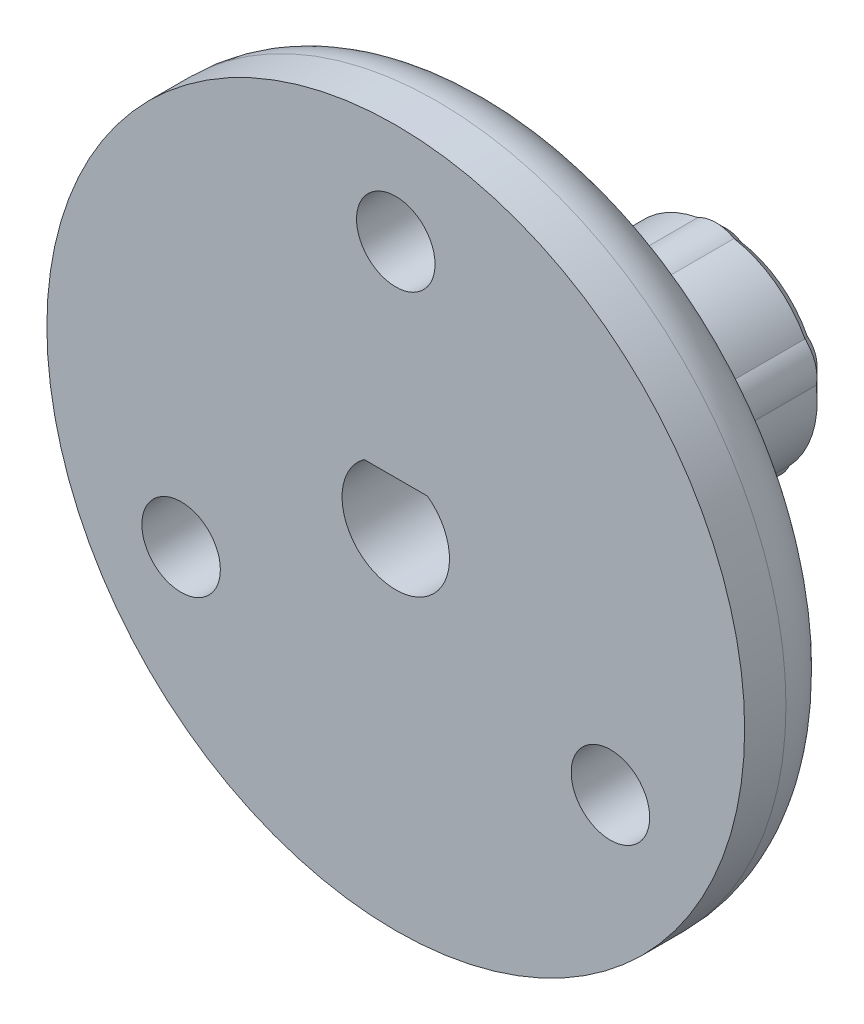
ISO-10303-21;
HEADER;
FILE_DESCRIPTION(('STEP AP214'),'2;1');
FILE_NAME('part.step','',(''),(''),'','','');
FILE_SCHEMA(('AUTOMOTIVE_DESIGN { 1 0 10303 214 1 1 1 1 }'));
ENDSEC;
DATA;
#1=APPLICATION_CONTEXT('core data for automotive mechanical design processes');
#2=APPLICATION_PROTOCOL_DEFINITION('international standard','automotive_design',2000,#1);
#3=PRODUCT_CONTEXT('',#1,'mechanical');
#4=PRODUCT('Part','Part','',(#3));
#5=PRODUCT_RELATED_PRODUCT_CATEGORY('part','',(#4));
#6=PRODUCT_DEFINITION_FORMATION('','',#4);
#7=PRODUCT_DEFINITION_CONTEXT('part definition',#1,'design');
#8=PRODUCT_DEFINITION('design','',#6,#7);
#9=PRODUCT_DEFINITION_SHAPE('','',#8);
#10=(LENGTH_UNIT() NAMED_UNIT(*) SI_UNIT(.MILLI.,.METRE.));
#11=(NAMED_UNIT(*) PLANE_ANGLE_UNIT() SI_UNIT($,.RADIAN.));
#12=(NAMED_UNIT(*) SI_UNIT($,.STERADIAN.) SOLID_ANGLE_UNIT());
#13=UNCERTAINTY_MEASURE_WITH_UNIT(LENGTH_MEASURE(1.E-05),#10,'distance_accuracy_value','');
#14=(GEOMETRIC_REPRESENTATION_CONTEXT(3) GLOBAL_UNCERTAINTY_ASSIGNED_CONTEXT((#13)) GLOBAL_UNIT_ASSIGNED_CONTEXT((#10,
#11,#12)) REPRESENTATION_CONTEXT('',''));
#15=CARTESIAN_POINT('',(0.,0.,0.));
#16=DIRECTION('',(0.,0.,1.));
#17=DIRECTION('',(1.,0.,0.));
#18=AXIS2_PLACEMENT_3D('',#15,#16,#17);
#19=CARTESIAN_POINT('',(0.,0.,16.));
#20=DIRECTION('',(0.,0.,-1.));
#21=DIRECTION('',(-1.,0.,0.));
#22=AXIS2_PLACEMENT_3D('',#19,#20,#21);
#23=CYLINDRICAL_SURFACE('',#22,4.9);
#24=DIRECTION('',(0.,0.,-1.));
#25=VECTOR('',#24,1.);
#26=CARTESIAN_POINT('',(-0.879711407089454,4.82038461538462,16.));
#27=LINE('',#26,#25);
#28=CARTESIAN_POINT('',(-0.879711407089453,4.82038461538462,8.));
#29=VERTEX_POINT('',#28);
#30=CARTESIAN_POINT('',(-0.879711407089454,4.82038461538462,0.499999999999987));
#31=VERTEX_POINT('',#30);
#32=EDGE_CURVE('E167',#29,#31,#27,.T.);
#33=ORIENTED_EDGE('',*,*,#32,.T.);
#34=CARTESIAN_POINT('',(0.,0.,0.499999999999987));
#35=DIRECTION('',(0.,0.,1.));
#36=DIRECTION('',(1.,0.,0.));
#37=AXIS2_PLACEMENT_3D('',#34,#35,#36);
#38=CIRCLE('',#37,4.9);
#39=CARTESIAN_POINT('',(-4.31261242457431,2.326236031749,0.499999999999987));
#40=VERTEX_POINT('',#39);
#41=EDGE_CURVE('E11',#31,#40,#38,.T.);
#42=ORIENTED_EDGE('',*,*,#41,.T.);
#43=DIRECTION('',(0.,0.,-1.));
#44=VECTOR('',#43,1.);
#45=CARTESIAN_POINT('',(-4.31261242457431,2.326236031749,16.));
#46=LINE('',#45,#44);
#47=CARTESIAN_POINT('',(-4.31261242457431,2.326236031749,8.));
#48=VERTEX_POINT('',#47);
#49=EDGE_CURVE('E181',#48,#40,#46,.T.);
#50=ORIENTED_EDGE('',*,*,#49,.F.);
#51=CARTESIAN_POINT('',(0.,0.,8.));
#52=DIRECTION('',(0.,0.,1.));
#53=DIRECTION('',(1.,0.,0.));
#54=AXIS2_PLACEMENT_3D('',#51,#52,#53);
#55=CIRCLE('',#54,4.9);
#56=EDGE_CURVE('E180',#29,#48,#55,.T.);
#57=ORIENTED_EDGE('',*,*,#56,.F.);
#58=EDGE_LOOP('',(#33,#42,#50,#57));
#59=FACE_BOUND('',#58,.T.);
#60=ADVANCED_FACE('F41',(#59),#23,.T.);
#61=CARTESIAN_POINT('',(-3.09093367795925,1.00430523171858,16.));
#62=DIRECTION('',(0.,0.,-1.));
#63=DIRECTION('',(-1.,0.,0.));
#64=AXIS2_PLACEMENT_3D('',#61,#62,#63);
#65=CYLINDRICAL_SURFACE('',#64,1.8);
#66=ORIENTED_EDGE('',*,*,#49,.T.);
#67=CARTESIAN_POINT('',(-3.09093367795925,1.00430523171858,0.499999999999987));
#68=DIRECTION('',(0.,0.,1.));
#69=DIRECTION('',(1.,0.,0.));
#70=AXIS2_PLACEMENT_3D('',#67,#68,#69);
#71=CIRCLE('',#70,1.8);
#72=CARTESIAN_POINT('',(-4.85630397444659,0.652925499405784,0.499999999999987));
#73=VERTEX_POINT('',#72);
#74=EDGE_CURVE('E56',#40,#73,#71,.T.);
#75=ORIENTED_EDGE('',*,*,#74,.T.);
#76=DIRECTION('',(0.,0.,-1.));
#77=VECTOR('',#76,1.);
#78=CARTESIAN_POINT('',(-4.85630397444659,0.652925499405784,16.));
#79=LINE('',#78,#77);
#80=CARTESIAN_POINT('',(-4.85630397444659,0.652925499405784,8.));
#81=VERTEX_POINT('',#80);
#82=EDGE_CURVE('E197',#81,#73,#79,.T.);
#83=ORIENTED_EDGE('',*,*,#82,.F.);
#84=CARTESIAN_POINT('',(-3.09093367795925,1.00430523171858,8.));
#85=DIRECTION('',(0.,0.,1.));
#86=DIRECTION('',(1.,0.,0.));
#87=AXIS2_PLACEMENT_3D('',#84,#85,#86);
#88=CIRCLE('',#87,1.8);
#89=EDGE_CURVE('E185',#48,#81,#88,.T.);
#90=ORIENTED_EDGE('',*,*,#89,.F.);
#91=EDGE_LOOP('',(#66,#75,#83,#90));
#92=FACE_BOUND('',#91,.T.);
#93=ADVANCED_FACE('F423',(#92),#65,.T.);
#94=ORIENTED_EDGE('',*,*,#82,.T.);
#95=CARTESIAN_POINT('',(0.,0.,0.499999999999987));
#96=DIRECTION('',(0.,0.,1.));
#97=DIRECTION('',(1.,0.,0.));
#98=AXIS2_PLACEMENT_3D('',#95,#96,#97);
#99=CIRCLE('',#98,4.9);
#100=CARTESIAN_POINT('',(-3.54505246578147,-3.38269168190906,0.499999999999987));
#101=VERTEX_POINT('',#100);
#102=EDGE_CURVE('E237',#73,#101,#99,.T.);
#103=ORIENTED_EDGE('',*,*,#102,.T.);
#104=DIRECTION('',(0.,0.,-1.));
#105=VECTOR('',#104,1.);
#106=CARTESIAN_POINT('',(-3.54505246578147,-3.38269168190906,16.));
#107=LINE('',#106,#105);
#108=CARTESIAN_POINT('',(-3.54505246578147,-3.38269168190906,8.));
#109=VERTEX_POINT('',#108);
#110=EDGE_CURVE('E416',#109,#101,#107,.T.);
#111=ORIENTED_EDGE('',*,*,#110,.F.);
#112=CARTESIAN_POINT('',(0.,0.,8.));
#113=DIRECTION('',(0.,0.,1.));
#114=DIRECTION('',(1.,0.,0.));
#115=AXIS2_PLACEMENT_3D('',#112,#113,#114);
#116=CIRCLE('',#115,4.9);
#117=EDGE_CURVE('E422',#81,#109,#116,.T.);
#118=ORIENTED_EDGE('',*,*,#117,.F.);
#119=EDGE_LOOP('',(#94,#103,#111,#118));
#120=FACE_BOUND('',#119,.T.);
#121=ADVANCED_FACE('F419',(#120),#23,.T.);
#122=CARTESIAN_POINT('',(-1.91030206995054,-2.62930523171858,16.));
#123=DIRECTION('',(0.,0.,-1.));
#124=DIRECTION('',(-1.,0.,0.));
#125=AXIS2_PLACEMENT_3D('',#122,#123,#124);
#126=CYLINDRICAL_SURFACE('',#125,1.8);
#127=ORIENTED_EDGE('',*,*,#110,.T.);
#128=CARTESIAN_POINT('',(-1.91030206995054,-2.62930523171858,0.499999999999987));
#129=DIRECTION('',(0.,0.,1.));
#130=DIRECTION('',(1.,0.,0.));
#131=AXIS2_PLACEMENT_3D('',#128,#129,#130);
#132=CIRCLE('',#131,1.8);
#133=CARTESIAN_POINT('',(-2.12164950881973,-4.41685446463034,0.499999999999987));
#134=VERTEX_POINT('',#133);
#135=EDGE_CURVE('E235',#101,#134,#132,.T.);
#136=ORIENTED_EDGE('',*,*,#135,.T.);
#137=DIRECTION('',(0.,0.,-1.));
#138=VECTOR('',#137,1.);
#139=CARTESIAN_POINT('',(-2.12164950881973,-4.41685446463034,16.));
#140=LINE('',#139,#138);
#141=CARTESIAN_POINT('',(-2.12164950881973,-4.41685446463034,8.));
#142=VERTEX_POINT('',#141);
#143=EDGE_CURVE('E413',#142,#134,#140,.T.);
#144=ORIENTED_EDGE('',*,*,#143,.F.);
#145=CARTESIAN_POINT('',(-1.91030206995054,-2.62930523171858,8.));
#146=DIRECTION('',(0.,0.,1.));
#147=DIRECTION('',(1.,0.,0.));
#148=AXIS2_PLACEMENT_3D('',#145,#146,#147);
#149=CIRCLE('',#148,1.8);
#150=EDGE_CURVE('E426',#109,#142,#149,.T.);
#151=ORIENTED_EDGE('',*,*,#150,.F.);
#152=EDGE_LOOP('',(#127,#136,#144,#151));
#153=FACE_BOUND('',#152,.T.);
#154=ADVANCED_FACE('F473',(#153),#126,.T.);
#155=ORIENTED_EDGE('',*,*,#143,.T.);
#156=CARTESIAN_POINT('',(0.,0.,0.499999999999987));
#157=DIRECTION('',(0.,0.,1.));
#158=DIRECTION('',(1.,0.,0.));
#159=AXIS2_PLACEMENT_3D('',#156,#157,#158);
#160=CIRCLE('',#159,4.9);
#161=CARTESIAN_POINT('',(2.12164950881973,-4.41685446463034,0.499999999999987));
#162=VERTEX_POINT('',#161);
#163=EDGE_CURVE('E233',#134,#162,#160,.T.);
#164=ORIENTED_EDGE('',*,*,#163,.T.);
#165=DIRECTION('',(0.,0.,-1.));
#166=VECTOR('',#165,1.);
#167=CARTESIAN_POINT('',(2.12164950881973,-4.41685446463034,16.));
#168=LINE('',#167,#166);
#169=CARTESIAN_POINT('',(2.12164950881973,-4.41685446463034,8.));
#170=VERTEX_POINT('',#169);
#171=EDGE_CURVE('E410',#170,#162,#168,.T.);
#172=ORIENTED_EDGE('',*,*,#171,.F.);
#173=CARTESIAN_POINT('',(0.,0.,8.));
#174=DIRECTION('',(0.,0.,1.));
#175=DIRECTION('',(1.,0.,0.));
#176=AXIS2_PLACEMENT_3D('',#173,#174,#175);
#177=CIRCLE('',#176,4.9);
#178=EDGE_CURVE('E498',#142,#170,#177,.T.);
#179=ORIENTED_EDGE('',*,*,#178,.F.);
#180=EDGE_LOOP('',(#155,#164,#172,#179));
#181=FACE_BOUND('',#180,.T.);
#182=ADVANCED_FACE('F474',(#181),#23,.T.);
#183=CARTESIAN_POINT('',(1.91030206995054,-2.62930523171858,16.));
#184=DIRECTION('',(0.,0.,-1.));
#185=DIRECTION('',(-1.,0.,0.));
#186=AXIS2_PLACEMENT_3D('',#183,#184,#185);
#187=CYLINDRICAL_SURFACE('',#186,1.8);
#188=ORIENTED_EDGE('',*,*,#171,.T.);
#189=CARTESIAN_POINT('',(1.91030206995054,-2.62930523171858,0.499999999999987));
#190=DIRECTION('',(0.,0.,1.));
#191=DIRECTION('',(1.,0.,0.));
#192=AXIS2_PLACEMENT_3D('',#189,#190,#191);
#193=CIRCLE('',#192,1.8);
#194=CARTESIAN_POINT('',(3.54505246578147,-3.38269168190906,0.499999999999987));
#195=VERTEX_POINT('',#194);
#196=EDGE_CURVE('E231',#162,#195,#193,.T.);
#197=ORIENTED_EDGE('',*,*,#196,.T.);
#198=DIRECTION('',(0.,0.,-1.));
#199=VECTOR('',#198,1.);
#200=CARTESIAN_POINT('',(3.54505246578147,-3.38269168190906,16.));
#201=LINE('',#200,#199);
#202=CARTESIAN_POINT('',(3.54505246578147,-3.38269168190906,8.));
#203=VERTEX_POINT('',#202);
#204=EDGE_CURVE('E404',#203,#195,#201,.T.);
#205=ORIENTED_EDGE('',*,*,#204,.F.);
#206=CARTESIAN_POINT('',(1.91030206995054,-2.62930523171858,8.));
#207=DIRECTION('',(0.,0.,1.));
#208=DIRECTION('',(1.,0.,0.));
#209=AXIS2_PLACEMENT_3D('',#206,#207,#208);
#210=CIRCLE('',#209,1.8);
#211=EDGE_CURVE('E500',#170,#203,#210,.T.);
#212=ORIENTED_EDGE('',*,*,#211,.F.);
#213=EDGE_LOOP('',(#188,#197,#205,#212));
#214=FACE_BOUND('',#213,.T.);
#215=ADVANCED_FACE('F481',(#214),#187,.T.);
#216=ORIENTED_EDGE('',*,*,#204,.T.);
#217=CARTESIAN_POINT('',(0.,0.,0.499999999999987));
#218=DIRECTION('',(0.,0.,1.));
#219=DIRECTION('',(1.,0.,0.));
#220=AXIS2_PLACEMENT_3D('',#217,#218,#219);
#221=CIRCLE('',#220,4.9);
#222=CARTESIAN_POINT('',(4.85630397444659,0.652925499405784,0.499999999999987));
#223=VERTEX_POINT('',#222);
#224=EDGE_CURVE('E229',#195,#223,#221,.T.);
#225=ORIENTED_EDGE('',*,*,#224,.T.);
#226=DIRECTION('',(0.,0.,-1.));
#227=VECTOR('',#226,1.);
#228=CARTESIAN_POINT('',(4.85630397444659,0.652925499405784,16.));
#229=LINE('',#228,#227);
#230=CARTESIAN_POINT('',(4.85630397444659,0.652925499405784,8.));
#231=VERTEX_POINT('',#230);
#232=EDGE_CURVE('E400',#231,#223,#229,.T.);
#233=ORIENTED_EDGE('',*,*,#232,.F.);
#234=CARTESIAN_POINT('',(0.,0.,8.));
#235=DIRECTION('',(0.,0.,1.));
#236=DIRECTION('',(1.,0.,0.));
#237=AXIS2_PLACEMENT_3D('',#234,#235,#236);
#238=CIRCLE('',#237,4.9);
#239=EDGE_CURVE('E504',#203,#231,#238,.T.);
#240=ORIENTED_EDGE('',*,*,#239,.F.);
#241=EDGE_LOOP('',(#216,#225,#233,#240));
#242=FACE_BOUND('',#241,.T.);
#243=ADVANCED_FACE('F476',(#242),#23,.T.);
#244=CARTESIAN_POINT('',(3.09093367795925,1.00430523171858,16.));
#245=DIRECTION('',(0.,0.,-1.));
#246=DIRECTION('',(-1.,0.,0.));
#247=AXIS2_PLACEMENT_3D('',#244,#245,#246);
#248=CYLINDRICAL_SURFACE('',#247,1.8);
#249=ORIENTED_EDGE('',*,*,#232,.T.);
#250=CARTESIAN_POINT('',(3.09093367795925,1.00430523171858,0.499999999999987));
#251=DIRECTION('',(0.,0.,1.));
#252=DIRECTION('',(1.,0.,0.));
#253=AXIS2_PLACEMENT_3D('',#250,#251,#252);
#254=CIRCLE('',#253,1.8);
#255=CARTESIAN_POINT('',(4.31261242457431,2.326236031749,0.499999999999987));
#256=VERTEX_POINT('',#255);
#257=EDGE_CURVE('E227',#223,#256,#254,.T.);
#258=ORIENTED_EDGE('',*,*,#257,.T.);
#259=DIRECTION('',(0.,0.,-1.));
#260=VECTOR('',#259,1.);
#261=CARTESIAN_POINT('',(4.31261242457431,2.326236031749,16.));
#262=LINE('',#261,#260);
#263=CARTESIAN_POINT('',(4.31261242457431,2.326236031749,8.));
#264=VERTEX_POINT('',#263);
#265=EDGE_CURVE('E398',#264,#256,#262,.T.);
#266=ORIENTED_EDGE('',*,*,#265,.F.);
#267=CARTESIAN_POINT('',(3.09093367795925,1.00430523171858,8.));
#268=DIRECTION('',(0.,0.,1.));
#269=DIRECTION('',(1.,0.,0.));
#270=AXIS2_PLACEMENT_3D('',#267,#268,#269);
#271=CIRCLE('',#270,1.8);
#272=EDGE_CURVE('E507',#231,#264,#271,.T.);
#273=ORIENTED_EDGE('',*,*,#272,.F.);
#274=EDGE_LOOP('',(#249,#258,#266,#273));
#275=FACE_BOUND('',#274,.T.);
#276=ADVANCED_FACE('F397',(#275),#248,.T.);
#277=ORIENTED_EDGE('',*,*,#265,.T.);
#278=CARTESIAN_POINT('',(0.,0.,0.499999999999987));
#279=DIRECTION('',(0.,0.,1.));
#280=DIRECTION('',(1.,0.,0.));
#281=AXIS2_PLACEMENT_3D('',#278,#279,#280);
#282=CIRCLE('',#281,4.9);
#283=CARTESIAN_POINT('',(0.879711407089454,4.82038461538462,0.499999999999987));
#284=VERTEX_POINT('',#283);
#285=EDGE_CURVE('E225',#256,#284,#282,.T.);
#286=ORIENTED_EDGE('',*,*,#285,.T.);
#287=DIRECTION('',(0.,0.,-1.));
#288=VECTOR('',#287,1.);
#289=CARTESIAN_POINT('',(0.879711407089454,4.82038461538462,16.));
#290=LINE('',#289,#288);
#291=CARTESIAN_POINT('',(0.879711407089454,4.82038461538462,8.));
#292=VERTEX_POINT('',#291);
#293=EDGE_CURVE('E176',#292,#284,#290,.T.);
#294=ORIENTED_EDGE('',*,*,#293,.F.);
#295=CARTESIAN_POINT('',(0.,0.,8.));
#296=DIRECTION('',(0.,0.,1.));
#297=DIRECTION('',(1.,0.,0.));
#298=AXIS2_PLACEMENT_3D('',#295,#296,#297);
#299=CIRCLE('',#298,4.9);
#300=EDGE_CURVE('E191',#264,#292,#299,.T.);
#301=ORIENTED_EDGE('',*,*,#300,.F.);
#302=EDGE_LOOP('',(#277,#286,#294,#301));
#303=FACE_BOUND('',#302,.T.);
#304=ADVANCED_FACE('F402',(#303),#23,.T.);
#305=CARTESIAN_POINT('',(0.,3.25,16.));
#306=DIRECTION('',(0.,0.,-1.));
#307=DIRECTION('',(-1.,0.,0.));
#308=AXIS2_PLACEMENT_3D('',#305,#306,#307);
#309=CYLINDRICAL_SURFACE('',#308,1.8);
#310=ORIENTED_EDGE('',*,*,#293,.T.);
#311=CARTESIAN_POINT('',(0.,3.25,0.499999999999987));
#312=DIRECTION('',(0.,0.,1.));
#313=DIRECTION('',(1.,0.,0.));
#314=AXIS2_PLACEMENT_3D('',#311,#312,#313);
#315=CIRCLE('',#314,1.8);
#316=EDGE_CURVE('E175',#284,#31,#315,.T.);
#317=ORIENTED_EDGE('',*,*,#316,.T.);
#318=ORIENTED_EDGE('',*,*,#32,.F.);
#319=CARTESIAN_POINT('',(0.,3.25,8.));
#320=DIRECTION('',(0.,0.,1.));
#321=DIRECTION('',(1.,0.,0.));
#322=AXIS2_PLACEMENT_3D('',#319,#320,#321);
#323=CIRCLE('',#322,1.8);
#324=EDGE_CURVE('E172',#292,#29,#323,.T.);
#325=ORIENTED_EDGE('',*,*,#324,.F.);
#326=EDGE_LOOP('',(#310,#317,#318,#325));
#327=FACE_BOUND('',#326,.T.);
#328=ADVANCED_FACE('F170',(#327),#309,.T.);
#329=CARTESIAN_POINT('',(0.,0.,16.));
#330=DIRECTION('',(0.,0.,1.));
#331=DIRECTION('',(1.,0.,0.));
#332=AXIS2_PLACEMENT_3D('',#329,#330,#331);
#333=PLANE('',#332);
#334=CARTESIAN_POINT('',(10.3923048454132,-6.00000000000005,16.));
#335=DIRECTION('',(0.,0.,1.));
#336=DIRECTION('',(-0.500000000000004,-0.866025403784436,0.));
#337=AXIS2_PLACEMENT_3D('',#334,#335,#336);
#338=CIRCLE('',#337,1.9);
#339=CARTESIAN_POINT('',(9.44230484541323,-7.64544826719048,16.));
#340=VERTEX_POINT('',#339);
#341=EDGE_CURVE('E531',#340,#340,#338,.T.);
#342=ORIENTED_EDGE('',*,*,#341,.F.);
#343=EDGE_LOOP('',(#342));
#344=FACE_BOUND('',#343,.T.);
#345=CARTESIAN_POINT('',(-10.3923048454133,-5.9999999999999,16.));
#346=DIRECTION('',(0.,0.,1.));
#347=DIRECTION('',(-0.499999999999992,0.866025403784443,0.));
#348=AXIS2_PLACEMENT_3D('',#345,#346,#347);
#349=CIRCLE('',#348,1.9);
#350=CARTESIAN_POINT('',(-11.3423048454133,-4.35455173280946,16.));
#351=VERTEX_POINT('',#350);
#352=EDGE_CURVE('E356',#351,#351,#349,.T.);
#353=ORIENTED_EDGE('',*,*,#352,.F.);
#354=EDGE_LOOP('',(#353));
#355=FACE_BOUND('',#354,.T.);
#356=CARTESIAN_POINT('',(0.,12.,16.));
#357=DIRECTION('',(0.,0.,1.));
#358=DIRECTION('',(1.,0.,0.));
#359=AXIS2_PLACEMENT_3D('',#356,#357,#358);
#360=CIRCLE('',#359,1.9);
#361=CARTESIAN_POINT('',(1.9,12.,16.));
#362=VERTEX_POINT('',#361);
#363=EDGE_CURVE('E520',#362,#362,#360,.T.);
#364=ORIENTED_EDGE('',*,*,#363,.F.);
#365=EDGE_LOOP('',(#364));
#366=FACE_BOUND('',#365,.T.);
#367=DIRECTION('',(1.,0.,0.));
#368=VECTOR('',#367,1.);
#369=CARTESIAN_POINT('',(1.53297097167559,2.1,16.));
#370=LINE('',#369,#368);
#371=CARTESIAN_POINT('',(-1.53297097167559,2.1,16.));
#372=VERTEX_POINT('',#371);
#373=CARTESIAN_POINT('',(1.53297097167559,2.1,16.));
#374=VERTEX_POINT('',#373);
#375=EDGE_CURVE('E432',#372,#374,#370,.T.);
#376=ORIENTED_EDGE('',*,*,#375,.T.);
#377=CARTESIAN_POINT('',(0.,0.,16.));
#378=DIRECTION('',(0.,0.,1.));
#379=DIRECTION('',(1.,0.,0.));
#380=AXIS2_PLACEMENT_3D('',#377,#378,#379);
#381=CIRCLE('',#380,2.6);
#382=EDGE_CURVE('E438',#374,#372,#381,.F.);
#383=ORIENTED_EDGE('',*,*,#382,.T.);
#384=EDGE_LOOP('',(#376,#383));
#385=FACE_BOUND('',#384,.T.);
#386=CARTESIAN_POINT('',(0.,0.,16.));
#387=DIRECTION('',(0.,0.,1.));
#388=DIRECTION('',(1.,0.,0.));
#389=AXIS2_PLACEMENT_3D('',#386,#387,#388);
#390=CIRCLE('',#389,16.8909336779592);
#391=CARTESIAN_POINT('',(16.8909336779592,0.,16.));
#392=VERTEX_POINT('',#391);
#393=EDGE_CURVE('E513',#392,#392,#390,.T.);
#394=ORIENTED_EDGE('',*,*,#393,.T.);
#395=EDGE_LOOP('',(#394));
#396=FACE_BOUND('',#395,.T.);
#397=ADVANCED_FACE('F452',(#344,#355,#366,#385,#396),#333,.T.);
#398=CARTESIAN_POINT('',(0.,0.,0.));
#399=DIRECTION('',(0.,0.,1.));
#400=DIRECTION('',(1.,0.,0.));
#401=AXIS2_PLACEMENT_3D('',#398,#399,#400);
#402=PLANE('',#401);
#403=CARTESIAN_POINT('',(0.,0.,0.));
#404=DIRECTION('',(0.,0.,1.));
#405=DIRECTION('',(1.,0.,0.));
#406=AXIS2_PLACEMENT_3D('',#403,#404,#405);
#407=CIRCLE('',#406,4.40000000000001);
#408=CARTESIAN_POINT('',(-3.91360925292221,2.01088602746196,0.));
#409=VERTEX_POINT('',#408);
#410=CARTESIAN_POINT('',(-0.703094491448568,4.34346153846155,0.));
#411=VERTEX_POINT('',#410);
#412=EDGE_CURVE('E204',#409,#411,#407,.F.);
#413=ORIENTED_EDGE('',*,*,#412,.T.);
#414=CARTESIAN_POINT('',(0.,3.25,0.));
#415=DIRECTION('',(0.,0.,1.));
#416=DIRECTION('',(1.,0.,0.));
#417=AXIS2_PLACEMENT_3D('',#414,#415,#416);
#418=CIRCLE('',#417,1.30000000000001);
#419=CARTESIAN_POINT('',(0.703094491448568,4.34346153846155,0.));
#420=VERTEX_POINT('',#419);
#421=EDGE_CURVE('E222',#411,#420,#418,.F.);
#422=ORIENTED_EDGE('',*,*,#421,.T.);
#423=CARTESIAN_POINT('',(0.,0.,0.));
#424=DIRECTION('',(0.,0.,1.));
#425=DIRECTION('',(1.,0.,0.));
#426=AXIS2_PLACEMENT_3D('',#423,#424,#425);
#427=CIRCLE('',#426,4.40000000000001);
#428=CARTESIAN_POINT('',(3.91360925292221,2.01088602746196,0.));
#429=VERTEX_POINT('',#428);
#430=EDGE_CURVE('E220',#420,#429,#427,.F.);
#431=ORIENTED_EDGE('',*,*,#430,.T.);
#432=CARTESIAN_POINT('',(3.09093367795925,1.00430523171858,0.));
#433=DIRECTION('',(0.,0.,1.));
#434=DIRECTION('',(1.,0.,0.));
#435=AXIS2_PLACEMENT_3D('',#432,#433,#434);
#436=CIRCLE('',#435,1.30000000000001);
#437=CARTESIAN_POINT('',(4.34814554594025,0.673520832135182,0.));
#438=VERTEX_POINT('',#437);
#439=EDGE_CURVE('E218',#429,#438,#436,.F.);
#440=ORIENTED_EDGE('',*,*,#439,.T.);
#441=CARTESIAN_POINT('',(0.,0.,0.));
#442=DIRECTION('',(0.,0.,1.));
#443=DIRECTION('',(1.,0.,0.));
#444=AXIS2_PLACEMENT_3D('',#441,#442,#443);
#445=CIRCLE('',#444,4.40000000000001);
#446=CARTESIAN_POINT('',(3.12183802844058,-3.1006656259878,0.));
#447=VERTEX_POINT('',#446);
#448=EDGE_CURVE('E216',#438,#447,#445,.F.);
#449=ORIENTED_EDGE('',*,*,#448,.T.);
#450=CARTESIAN_POINT('',(1.91030206995054,-2.62930523171858,0.));
#451=DIRECTION('',(0.,0.,1.));
#452=DIRECTION('',(1.,0.,0.));
#453=AXIS2_PLACEMENT_3D('',#450,#451,#452);
#454=CIRCLE('',#453,1.30000000000001);
#455=CARTESIAN_POINT('',(1.98420724397397,-3.92720277207089,0.));
#456=VERTEX_POINT('',#455);
#457=EDGE_CURVE('E214',#447,#456,#454,.F.);
#458=ORIENTED_EDGE('',*,*,#457,.T.);
#459=CARTESIAN_POINT('',(0.,0.,0.));
#460=DIRECTION('',(0.,0.,1.));
#461=DIRECTION('',(1.,0.,0.));
#462=AXIS2_PLACEMENT_3D('',#459,#460,#461);
#463=CIRCLE('',#462,4.40000000000001);
#464=CARTESIAN_POINT('',(-1.98420724397397,-3.92720277207089,0.));
#465=VERTEX_POINT('',#464);
#466=EDGE_CURVE('E212',#456,#465,#463,.F.);
#467=ORIENTED_EDGE('',*,*,#466,.T.);
#468=CARTESIAN_POINT('',(-1.91030206995054,-2.62930523171858,0.));
#469=DIRECTION('',(0.,0.,1.));
#470=DIRECTION('',(1.,0.,0.));
#471=AXIS2_PLACEMENT_3D('',#468,#469,#470);
#472=CIRCLE('',#471,1.30000000000001);
#473=CARTESIAN_POINT('',(-3.12183802844058,-3.1006656259878,0.));
#474=VERTEX_POINT('',#473);
#475=EDGE_CURVE('E210',#465,#474,#472,.F.);
#476=ORIENTED_EDGE('',*,*,#475,.T.);
#477=CARTESIAN_POINT('',(0.,0.,0.));
#478=DIRECTION('',(0.,0.,1.));
#479=DIRECTION('',(1.,0.,0.));
#480=AXIS2_PLACEMENT_3D('',#477,#478,#479);
#481=CIRCLE('',#480,4.40000000000001);
#482=CARTESIAN_POINT('',(-4.34814554594025,0.673520832135183,0.));
#483=VERTEX_POINT('',#482);
#484=EDGE_CURVE('E208',#474,#483,#481,.F.);
#485=ORIENTED_EDGE('',*,*,#484,.T.);
#486=CARTESIAN_POINT('',(-3.09093367795925,1.00430523171858,0.));
#487=DIRECTION('',(0.,0.,1.));
#488=DIRECTION('',(1.,0.,0.));
#489=AXIS2_PLACEMENT_3D('',#486,#487,#488);
#490=CIRCLE('',#489,1.30000000000001);
#491=EDGE_CURVE('E206',#483,#409,#490,.F.);
#492=ORIENTED_EDGE('',*,*,#491,.T.);
#493=EDGE_LOOP('',(#413,#422,#431,#440,#449,#458,#467,#476,#485,#492));
#494=FACE_BOUND('',#493,.T.);
#495=CARTESIAN_POINT('',(0.,0.,0.));
#496=DIRECTION('',(0.,0.,-1.));
#497=DIRECTION('',(-1.,0.,0.));
#498=AXIS2_PLACEMENT_3D('',#495,#496,#497);
#499=CIRCLE('',#498,2.6);
#500=CARTESIAN_POINT('',(1.53297097167559,2.1,0.));
#501=VERTEX_POINT('',#500);
#502=CARTESIAN_POINT('',(-1.53297097167559,2.1,0.));
#503=VERTEX_POINT('',#502);
#504=EDGE_CURVE('E184',#501,#503,#499,.T.);
#505=ORIENTED_EDGE('',*,*,#504,.F.);
#506=DIRECTION('',(1.,0.,0.));
#507=VECTOR('',#506,1.);
#508=CARTESIAN_POINT('',(1.53297097167559,2.1,0.));
#509=LINE('',#508,#507);
#510=EDGE_CURVE('E430',#503,#501,#509,.T.);
#511=ORIENTED_EDGE('',*,*,#510,.F.);
#512=EDGE_LOOP('',(#505,#511));
#513=FACE_BOUND('',#512,.T.);
#514=ADVANCED_FACE('F370',(#494,#513),#402,.F.);
#515=CARTESIAN_POINT('',(1.53297097167559,2.1,23.00927956355));
#516=DIRECTION('',(0.,1.,0.));
#517=DIRECTION('',(0.,0.,1.));
#518=AXIS2_PLACEMENT_3D('',#515,#516,#517);
#519=PLANE('',#518);
#520=DIRECTION('',(0.,0.,-1.));
#521=VECTOR('',#520,1.);
#522=CARTESIAN_POINT('',(-1.53297097167559,2.1,23.00927956355));
#523=LINE('',#522,#521);
#524=EDGE_CURVE('E177',#372,#503,#523,.T.);
#525=ORIENTED_EDGE('',*,*,#524,.T.);
#526=ORIENTED_EDGE('',*,*,#510,.T.);
#527=DIRECTION('',(0.,0.,-1.));
#528=VECTOR('',#527,1.);
#529=CARTESIAN_POINT('',(1.53297097167559,2.1,23.00927956355));
#530=LINE('',#529,#528);
#531=EDGE_CURVE('E437',#374,#501,#530,.T.);
#532=ORIENTED_EDGE('',*,*,#531,.F.);
#533=ORIENTED_EDGE('',*,*,#375,.F.);
#534=EDGE_LOOP('',(#525,#526,#532,#533));
#535=FACE_BOUND('',#534,.T.);
#536=ADVANCED_FACE('F445',(#535),#519,.F.);
#537=CARTESIAN_POINT('',(0.,0.,23.00927956355));
#538=DIRECTION('',(0.,0.,-1.));
#539=DIRECTION('',(-1.,0.,0.));
#540=AXIS2_PLACEMENT_3D('',#537,#538,#539);
#541=CYLINDRICAL_SURFACE('',#540,2.6);
#542=ORIENTED_EDGE('',*,*,#531,.T.);
#543=ORIENTED_EDGE('',*,*,#504,.T.);
#544=ORIENTED_EDGE('',*,*,#524,.F.);
#545=ORIENTED_EDGE('',*,*,#382,.F.);
#546=EDGE_LOOP('',(#542,#543,#544,#545));
#547=FACE_BOUND('',#546,.T.);
#548=ADVANCED_FACE('F450',(#547),#541,.F.);
#549=CARTESIAN_POINT('',(0.,0.,16.));
#550=DIRECTION('',(0.,0.,1.));
#551=DIRECTION('',(1.,0.,0.));
#552=AXIS2_PLACEMENT_3D('',#549,#550,#551);
#553=CYLINDRICAL_SURFACE('',#552,6.89093367795925);
#554=CARTESIAN_POINT('',(0.,0.,11.));
#555=DIRECTION('',(0.,0.,1.));
#556=DIRECTION('',(1.,0.,0.));
#557=AXIS2_PLACEMENT_3D('',#554,#555,#556);
#558=CIRCLE('',#557,6.89093367795925);
#559=CARTESIAN_POINT('',(6.89093367795925,0.,11.));
#560=VERTEX_POINT('',#559);
#561=EDGE_CURVE('E516',#560,#560,#558,.T.);
#562=ORIENTED_EDGE('',*,*,#561,.F.);
#563=EDGE_LOOP('',(#562));
#564=FACE_BOUND('',#563,.T.);
#565=CARTESIAN_POINT('',(0.,0.,8.));
#566=DIRECTION('',(0.,0.,1.));
#567=DIRECTION('',(1.,0.,0.));
#568=AXIS2_PLACEMENT_3D('',#565,#566,#567);
#569=CIRCLE('',#568,6.89093367795925);
#570=CARTESIAN_POINT('',(6.89093367795925,0.,8.));
#571=VERTEX_POINT('',#570);
#572=EDGE_CURVE('E510',#571,#571,#569,.T.);
#573=ORIENTED_EDGE('',*,*,#572,.T.);
#574=EDGE_LOOP('',(#573));
#575=FACE_BOUND('',#574,.T.);
#576=ADVANCED_FACE('F565',(#564,#575),#553,.T.);
#577=CARTESIAN_POINT('',(-6.89093367795925,0.,8.));
#578=DIRECTION('',(0.,0.,1.));
#579=DIRECTION('',(1.,0.,0.));
#580=AXIS2_PLACEMENT_3D('',#577,#578,#579);
#581=PLANE('',#580);
#582=ORIENTED_EDGE('',*,*,#324,.T.);
#583=ORIENTED_EDGE('',*,*,#56,.T.);
#584=ORIENTED_EDGE('',*,*,#89,.T.);
#585=ORIENTED_EDGE('',*,*,#117,.T.);
#586=ORIENTED_EDGE('',*,*,#150,.T.);
#587=ORIENTED_EDGE('',*,*,#178,.T.);
#588=ORIENTED_EDGE('',*,*,#211,.T.);
#589=ORIENTED_EDGE('',*,*,#239,.T.);
#590=ORIENTED_EDGE('',*,*,#272,.T.);
#591=ORIENTED_EDGE('',*,*,#300,.T.);
#592=EDGE_LOOP('',(#582,#583,#584,#585,#586,#587,#588,#589,#590,#591));
#593=FACE_BOUND('',#592,.T.);
#594=ORIENTED_EDGE('',*,*,#572,.F.);
#595=EDGE_LOOP('',(#594));
#596=FACE_BOUND('',#595,.T.);
#597=ADVANCED_FACE('F188',(#593,#596),#581,.F.);
#598=CARTESIAN_POINT('',(0.,0.,16.));
#599=DIRECTION('',(0.,0.,1.));
#600=DIRECTION('',(1.,0.,0.));
#601=AXIS2_PLACEMENT_3D('',#598,#599,#600);
#602=CYLINDRICAL_SURFACE('',#601,16.8909336779592);
#603=CARTESIAN_POINT('',(0.,0.,14.));
#604=DIRECTION('',(0.,0.,1.));
#605=DIRECTION('',(1.,0.,0.));
#606=AXIS2_PLACEMENT_3D('',#603,#604,#605);
#607=CIRCLE('',#606,16.8909336779592);
#608=CARTESIAN_POINT('',(16.8909336779592,0.,14.));
#609=VERTEX_POINT('',#608);
#610=EDGE_CURVE('E192',#609,#609,#607,.T.);
#611=ORIENTED_EDGE('',*,*,#610,.T.);
#612=EDGE_LOOP('',(#611));
#613=FACE_BOUND('',#612,.T.);
#614=ORIENTED_EDGE('',*,*,#393,.F.);
#615=EDGE_LOOP('',(#614));
#616=FACE_BOUND('',#615,.T.);
#617=ADVANCED_FACE('F553',(#613,#616),#602,.T.);
#618=CARTESIAN_POINT('',(-16.8909336779592,0.,11.));
#619=DIRECTION('',(0.,0.,1.));
#620=DIRECTION('',(1.,0.,0.));
#621=AXIS2_PLACEMENT_3D('',#618,#619,#620);
#622=PLANE('',#621);
#623=CARTESIAN_POINT('',(0.,0.,11.));
#624=DIRECTION('',(0.,0.,1.));
#625=DIRECTION('',(1.,0.,0.));
#626=AXIS2_PLACEMENT_3D('',#623,#624,#625);
#627=CIRCLE('',#626,13.8909336779592);
#628=CARTESIAN_POINT('',(13.8909336779592,0.,11.));
#629=VERTEX_POINT('',#628);
#630=EDGE_CURVE('E195',#629,#629,#627,.F.);
#631=ORIENTED_EDGE('',*,*,#630,.T.);
#632=EDGE_LOOP('',(#631));
#633=FACE_BOUND('',#632,.T.);
#634=ORIENTED_EDGE('',*,*,#561,.T.);
#635=EDGE_LOOP('',(#634));
#636=FACE_BOUND('',#635,.T.);
#637=ADVANCED_FACE('F555',(#633,#636),#622,.F.);
#638=CARTESIAN_POINT('',(0.,0.,14.));
#639=DIRECTION('',(0.,0.,1.));
#640=DIRECTION('',(1.,0.,0.));
#641=AXIS2_PLACEMENT_3D('',#638,#639,#640);
#642=TOROIDAL_SURFACE('',#641,13.8909336779592,3.);
#643=ORIENTED_EDGE('',*,*,#630,.F.);
#644=EDGE_LOOP('',(#643));
#645=FACE_BOUND('',#644,.T.);
#646=ORIENTED_EDGE('',*,*,#610,.F.);
#647=EDGE_LOOP('',(#646));
#648=FACE_BOUND('',#647,.T.);
#649=ADVANCED_FACE('F562',(#645,#648),#642,.T.);
#650=CARTESIAN_POINT('',(0.,12.,11.5));
#651=DIRECTION('',(0.,0.,1.));
#652=DIRECTION('',(1.,0.,0.));
#653=AXIS2_PLACEMENT_3D('',#650,#651,#652);
#654=CYLINDRICAL_SURFACE('',#653,1.9);
#655=CARTESIAN_POINT('',(0.,12.,11.5));
#656=DIRECTION('',(0.,0.,1.));
#657=DIRECTION('',(1.,0.,0.));
#658=AXIS2_PLACEMENT_3D('',#655,#656,#657);
#659=CIRCLE('',#658,1.9);
#660=CARTESIAN_POINT('',(1.9,12.,11.5));
#661=VERTEX_POINT('',#660);
#662=EDGE_CURVE('E519',#661,#661,#659,.T.);
#663=ORIENTED_EDGE('',*,*,#662,.F.);
#664=EDGE_LOOP('',(#663));
#665=FACE_BOUND('',#664,.T.);
#666=ORIENTED_EDGE('',*,*,#363,.T.);
#667=EDGE_LOOP('',(#666));
#668=FACE_BOUND('',#667,.T.);
#669=ADVANCED_FACE('F609',(#665,#668),#654,.F.);
#670=CARTESIAN_POINT('',(0.,12.,11.5));
#671=DIRECTION('',(0.,0.,1.));
#672=DIRECTION('',(1.,0.,0.));
#673=AXIS2_PLACEMENT_3D('',#670,#671,#672);
#674=PLANE('',#673);
#675=ORIENTED_EDGE('',*,*,#662,.T.);
#676=EDGE_LOOP('',(#675));
#677=FACE_BOUND('',#676,.T.);
#678=ADVANCED_FACE('F618',(#677),#674,.T.);
#679=CARTESIAN_POINT('',(-10.3923048454133,-5.9999999999999,11.5));
#680=DIRECTION('',(0.,0.,1.));
#681=DIRECTION('',(1.,0.,0.));
#682=AXIS2_PLACEMENT_3D('',#679,#680,#681);
#683=CYLINDRICAL_SURFACE('',#682,1.9);
#684=CARTESIAN_POINT('',(-10.3923048454133,-5.9999999999999,11.5));
#685=DIRECTION('',(0.,0.,1.));
#686=DIRECTION('',(-0.499999999999992,0.866025403784443,0.));
#687=AXIS2_PLACEMENT_3D('',#684,#685,#686);
#688=CIRCLE('',#687,1.9);
#689=CARTESIAN_POINT('',(-11.3423048454133,-4.35455173280946,11.5));
#690=VERTEX_POINT('',#689);
#691=EDGE_CURVE('E528',#690,#690,#688,.T.);
#692=ORIENTED_EDGE('',*,*,#691,.F.);
#693=EDGE_LOOP('',(#692));
#694=FACE_BOUND('',#693,.T.);
#695=ORIENTED_EDGE('',*,*,#352,.T.);
#696=EDGE_LOOP('',(#695));
#697=FACE_BOUND('',#696,.T.);
#698=ADVANCED_FACE('F627',(#694,#697),#683,.F.);
#699=CARTESIAN_POINT('',(-10.3923048454133,-5.9999999999999,11.5));
#700=DIRECTION('',(0.,0.,1.));
#701=DIRECTION('',(-0.499999999999992,0.866025403784443,0.));
#702=AXIS2_PLACEMENT_3D('',#699,#700,#701);
#703=PLANE('',#702);
#704=ORIENTED_EDGE('',*,*,#691,.T.);
#705=EDGE_LOOP('',(#704));
#706=FACE_BOUND('',#705,.T.);
#707=ADVANCED_FACE('F542',(#706),#703,.T.);
#708=CARTESIAN_POINT('',(10.3923048454132,-6.00000000000005,11.5));
#709=DIRECTION('',(0.,0.,1.));
#710=DIRECTION('',(1.,0.,0.));
#711=AXIS2_PLACEMENT_3D('',#708,#709,#710);
#712=CYLINDRICAL_SURFACE('',#711,1.9);
#713=CARTESIAN_POINT('',(10.3923048454132,-6.00000000000005,11.5));
#714=DIRECTION('',(0.,0.,1.));
#715=DIRECTION('',(-0.500000000000004,-0.866025403784436,0.));
#716=AXIS2_PLACEMENT_3D('',#713,#714,#715);
#717=CIRCLE('',#716,1.9);
#718=CARTESIAN_POINT('',(9.44230484541323,-7.64544826719048,11.5));
#719=VERTEX_POINT('',#718);
#720=EDGE_CURVE('E523',#719,#719,#717,.T.);
#721=ORIENTED_EDGE('',*,*,#720,.F.);
#722=EDGE_LOOP('',(#721));
#723=FACE_BOUND('',#722,.T.);
#724=ORIENTED_EDGE('',*,*,#341,.T.);
#725=EDGE_LOOP('',(#724));
#726=FACE_BOUND('',#725,.T.);
#727=ADVANCED_FACE('F539',(#723,#726),#712,.F.);
#728=CARTESIAN_POINT('',(10.3923048454132,-6.00000000000005,11.5));
#729=DIRECTION('',(0.,0.,1.));
#730=DIRECTION('',(-0.500000000000004,-0.866025403784436,0.));
#731=AXIS2_PLACEMENT_3D('',#728,#729,#730);
#732=PLANE('',#731);
#733=ORIENTED_EDGE('',*,*,#720,.T.);
#734=EDGE_LOOP('',(#733));
#735=FACE_BOUND('',#734,.T.);
#736=ADVANCED_FACE('F537',(#735),#732,.T.);
#737=CARTESIAN_POINT('',(0.,0.,0.499999999999987));
#738=DIRECTION('',(0.,0.,1.));
#739=DIRECTION('',(1.,0.,0.));
#740=AXIS2_PLACEMENT_3D('',#737,#738,#739);
#741=CONICAL_SURFACE('',#740,4.9,0.785398163397454);
#742=CARTESIAN_POINT('',(-1.98420724397397,-3.92720277207089,0.));
#743=CARTESIAN_POINT('',(-1.99522545414142,-3.96821882156102,0.0415780074214474));
#744=CARTESIAN_POINT('',(-2.00637530890947,-4.00917140027715,0.0831833042168129));
#745=CARTESIAN_POINT('',(-2.02890397538659,-4.09096502043498,0.166440385395752));
#746=CARTESIAN_POINT('',(-2.04028278392269,-4.1318060634135,0.208092169127537));
#747=CARTESIAN_POINT('',(-2.07471157889299,-4.25418659511654,0.333106740370593));
#748=CARTESIAN_POINT('',(-2.09805396200353,-4.33558358758235,0.416528850403666));
#749=CARTESIAN_POINT('',(-2.12164950881974,-4.41685446463034,0.499999999999987));
#750=B_SPLINE_CURVE_WITH_KNOTS('',3,(#742,#743,#744,#745,#746,#747,#748,#749),.UNSPECIFIED.,.F.,
.F.,(4,2,2,4),(0.,0.178302508502199,0.356602547681663,0.713202186750979),.UNSPECIFIED.);
#751=EDGE_CURVE('E346',#465,#134,#750,.T.);
#752=ORIENTED_EDGE('',*,*,#751,.F.);
#753=ORIENTED_EDGE('',*,*,#466,.F.);
#754=CARTESIAN_POINT('',(1.98420724397397,-3.92720277207089,0.));
#755=CARTESIAN_POINT('',(1.99522545414142,-3.96821882156102,0.0415780074214475));
#756=CARTESIAN_POINT('',(2.00637530890947,-4.00917140027715,0.0831833042168132));
#757=CARTESIAN_POINT('',(2.02890397538659,-4.09096502043498,0.166440385395753));
#758=CARTESIAN_POINT('',(2.04028278392269,-4.1318060634135,0.208092169127537));
#759=CARTESIAN_POINT('',(2.07471157889299,-4.25418659511653,0.333106740370593));
#760=CARTESIAN_POINT('',(2.09805396200354,-4.33558358758235,0.416528850403666));
#761=CARTESIAN_POINT('',(2.12164950881974,-4.41685446463034,0.499999999999987));
#762=B_SPLINE_CURVE_WITH_KNOTS('',3,(#754,#755,#756,#757,#758,#759,#760,#761),.UNSPECIFIED.,.F.,
.F.,(4,2,2,4),(0.,0.178302508502199,0.356602547681662,0.713202186750979),.UNSPECIFIED.);
#763=EDGE_CURVE('E47',#162,#456,#762,.F.);
#764=ORIENTED_EDGE('',*,*,#763,.F.);
#765=ORIENTED_EDGE('',*,*,#163,.F.);
#766=EDGE_LOOP('',(#752,#753,#764,#765));
#767=FACE_BOUND('',#766,.T.);
#768=ADVANCED_FACE('F44',(#767),#741,.T.);
#769=CARTESIAN_POINT('',(1.91030206995054,-2.62930523171858,0.499999999999987));
#770=DIRECTION('',(0.,0.,1.));
#771=DIRECTION('',(1.,0.,0.));
#772=AXIS2_PLACEMENT_3D('',#769,#770,#771);
#773=CONICAL_SURFACE('',#772,1.8,0.785398163397454);
#774=ORIENTED_EDGE('',*,*,#763,.T.);
#775=ORIENTED_EDGE('',*,*,#457,.F.);
#776=CARTESIAN_POINT('',(3.12183802844058,-3.1006656259878,0.));
#777=CARTESIAN_POINT('',(3.15744179539151,-3.12381922290004,0.0415780074214475));
#778=CARTESIAN_POINT('',(3.19294451763044,-3.1470784077197,0.0831833042168129));
#779=CARTESIAN_POINT('',(3.26377313227087,-3.19378006143642,0.166440385395752));
#780=CARTESIAN_POINT('',(3.2990990271145,-3.21722252779071,0.208092169127537));
#781=CARTESIAN_POINT('',(3.40485074651666,-3.28778392167229,0.333106740370592));
#782=CARTESIAN_POINT('',(3.47505069353773,-3.33513690119837,0.416528850403665));
#783=CARTESIAN_POINT('',(3.54505246578147,-3.38269168190906,0.499999999999986));
#784=B_SPLINE_CURVE_WITH_KNOTS('',3,(#776,#777,#778,#779,#780,#781,#782,#783),.UNSPECIFIED.,.F.,
.F.,(4,2,2,4),(0.,0.178302508502198,0.356602547681662,0.713202186750978),.UNSPECIFIED.);
#785=EDGE_CURVE('E330',#195,#447,#784,.F.);
#786=ORIENTED_EDGE('',*,*,#785,.F.);
#787=ORIENTED_EDGE('',*,*,#196,.F.);
#788=EDGE_LOOP('',(#774,#775,#786,#787));
#789=FACE_BOUND('',#788,.T.);
#790=ADVANCED_FACE('F342',(#789),#773,.T.);
#791=CARTESIAN_POINT('',(-1.91030206995054,-2.62930523171858,0.499999999999987));
#792=DIRECTION('',(0.,0.,1.));
#793=DIRECTION('',(1.,0.,0.));
#794=AXIS2_PLACEMENT_3D('',#791,#792,#793);
#795=CONICAL_SURFACE('',#794,1.8,0.785398163397454);
#796=ORIENTED_EDGE('',*,*,#751,.T.);
#797=ORIENTED_EDGE('',*,*,#135,.F.);
#798=CARTESIAN_POINT('',(-3.12183802844058,-3.1006656259878,0.));
#799=CARTESIAN_POINT('',(-3.15744179539151,-3.12381922290004,0.0415780074214474));
#800=CARTESIAN_POINT('',(-3.19294451763044,-3.1470784077197,0.0831833042168128));
#801=CARTESIAN_POINT('',(-3.26377313227087,-3.19378006143642,0.166440385395752));
#802=CARTESIAN_POINT('',(-3.2990990271145,-3.21722252779071,0.208092169127537));
#803=CARTESIAN_POINT('',(-3.40485074651666,-3.28778392167229,0.333106740370593));
#804=CARTESIAN_POINT('',(-3.47505069353773,-3.33513690119838,0.416528850403666));
#805=CARTESIAN_POINT('',(-3.54505246578147,-3.38269168190906,0.499999999999987));
#806=B_SPLINE_CURVE_WITH_KNOTS('',3,(#798,#799,#800,#801,#802,#803,#804,#805),.UNSPECIFIED.,.F.,
.F.,(4,2,2,4),(0.,0.178302508502199,0.356602547681662,0.71320218675098),.UNSPECIFIED.);
#807=EDGE_CURVE('E323',#474,#101,#806,.T.);
#808=ORIENTED_EDGE('',*,*,#807,.F.);
#809=ORIENTED_EDGE('',*,*,#475,.F.);
#810=EDGE_LOOP('',(#796,#797,#808,#809));
#811=FACE_BOUND('',#810,.T.);
#812=ADVANCED_FACE('F336',(#811),#795,.T.);
#813=CARTESIAN_POINT('',(0.,0.,0.499999999999987));
#814=DIRECTION('',(0.,0.,1.));
#815=DIRECTION('',(1.,0.,0.));
#816=AXIS2_PLACEMENT_3D('',#813,#814,#815);
#817=CONICAL_SURFACE('',#816,4.9,0.785398163397454);
#818=ORIENTED_EDGE('',*,*,#785,.T.);
#819=ORIENTED_EDGE('',*,*,#448,.F.);
#820=CARTESIAN_POINT('',(4.34814554594025,0.673520832135182,0.));
#821=CARTESIAN_POINT('',(4.39055894126986,0.671325116378275,0.0415780074214474));
#822=CARTESIAN_POINT('',(4.43295265272506,0.669274215624408,0.0831833042168128));
#823=CARTESIAN_POINT('',(4.51770474896956,0.665424632020696,0.166440385395752));
#824=CARTESIAN_POINT('',(4.56006313423998,0.663625945678263,0.208092169127537));
#825=CARTESIAN_POINT('',(4.68709301912549,0.658552011406078,0.333106740370593));
#826=CARTESIAN_POINT('',(4.77171935228729,0.655598883006271,0.416528850403666));
#827=CARTESIAN_POINT('',(4.85630397444659,0.652925499405786,0.499999999999987));
#828=B_SPLINE_CURVE_WITH_KNOTS('',3,(#820,#821,#822,#823,#824,#825,#826,#827),.UNSPECIFIED.,.F.,
.F.,(4,2,2,4),(0.,0.178302508502198,0.356602547681662,0.713202186750979),.UNSPECIFIED.);
#829=EDGE_CURVE('E304',#223,#438,#828,.F.);
#830=ORIENTED_EDGE('',*,*,#829,.F.);
#831=ORIENTED_EDGE('',*,*,#224,.F.);
#832=EDGE_LOOP('',(#818,#819,#830,#831));
#833=FACE_BOUND('',#832,.T.);
#834=ADVANCED_FACE('F318',(#833),#817,.T.);
#835=CARTESIAN_POINT('',(0.,0.,0.499999999999987));
#836=DIRECTION('',(0.,0.,1.));
#837=DIRECTION('',(1.,0.,0.));
#838=AXIS2_PLACEMENT_3D('',#835,#836,#837);
#839=CONICAL_SURFACE('',#838,4.9,0.785398163397454);
#840=ORIENTED_EDGE('',*,*,#807,.T.);
#841=ORIENTED_EDGE('',*,*,#102,.F.);
#842=CARTESIAN_POINT('',(-4.34814554594025,0.673520832135183,0.));
#843=CARTESIAN_POINT('',(-4.39055894126986,0.671325116378275,0.0415780074214475));
#844=CARTESIAN_POINT('',(-4.43295265272506,0.669274215624407,0.0831833042168129));
#845=CARTESIAN_POINT('',(-4.51770474896956,0.665424632020696,0.166440385395752));
#846=CARTESIAN_POINT('',(-4.56006313423998,0.663625945678264,0.208092169127537));
#847=CARTESIAN_POINT('',(-4.68709301912549,0.658552011406082,0.333106740370592));
#848=CARTESIAN_POINT('',(-4.77171935228729,0.655598883006277,0.416528850403666));
#849=CARTESIAN_POINT('',(-4.85630397444659,0.652925499405789,0.499999999999987));
#850=B_SPLINE_CURVE_WITH_KNOTS('',3,(#842,#843,#844,#845,#846,#847,#848,#849),.UNSPECIFIED.,.F.,
.F.,(4,2,2,4),(0.,0.178302508502198,0.356602547681662,0.713202186750979),.UNSPECIFIED.);
#851=EDGE_CURVE('E297',#483,#73,#850,.T.);
#852=ORIENTED_EDGE('',*,*,#851,.F.);
#853=ORIENTED_EDGE('',*,*,#484,.F.);
#854=EDGE_LOOP('',(#840,#841,#852,#853));
#855=FACE_BOUND('',#854,.T.);
#856=ADVANCED_FACE('F312',(#855),#839,.T.);
#857=CARTESIAN_POINT('',(3.09093367795925,1.00430523171858,0.499999999999987));
#858=DIRECTION('',(0.,0.,1.));
#859=DIRECTION('',(1.,0.,0.));
#860=AXIS2_PLACEMENT_3D('',#857,#858,#859);
#861=CONICAL_SURFACE('',#860,1.8,0.785398163397454);
#862=ORIENTED_EDGE('',*,*,#829,.T.);
#863=ORIENTED_EDGE('',*,*,#439,.F.);
#864=CARTESIAN_POINT('',(3.91360925292221,2.01088602746196,0.));
#865=CARTESIAN_POINT('',(3.94663180119287,2.03759236709851,0.0415780074214475));
#866=CARTESIAN_POINT('',(3.97972354499772,2.06416997904548,0.0831833042168129));
#867=CARTESIAN_POINT('',(4.04602670269869,2.11710038987554,0.166440385395752));
#868=CARTESIAN_POINT('',(4.07923811493116,2.14345319186699,0.208092169127537));
#869=CARTESIAN_POINT('',(4.17902506686074,2.22222438385764,0.333106740370593));
#870=CARTESIAN_POINT('',(4.24575340323875,2.27435562550775,0.416528850403666));
#871=CARTESIAN_POINT('',(4.31261242457431,2.326236031749,0.499999999999987));
#872=B_SPLINE_CURVE_WITH_KNOTS('',3,(#864,#865,#866,#867,#868,#869,#870,#871),.UNSPECIFIED.,.F.,
.F.,(4,2,2,4),(0.,0.178302508502198,0.356602547681662,0.713202186750979),.UNSPECIFIED.);
#873=EDGE_CURVE('E278',#256,#429,#872,.F.);
#874=ORIENTED_EDGE('',*,*,#873,.F.);
#875=ORIENTED_EDGE('',*,*,#257,.F.);
#876=EDGE_LOOP('',(#862,#863,#874,#875));
#877=FACE_BOUND('',#876,.T.);
#878=ADVANCED_FACE('F292',(#877),#861,.T.);
#879=CARTESIAN_POINT('',(-3.09093367795925,1.00430523171858,0.499999999999987));
#880=DIRECTION('',(0.,0.,1.));
#881=DIRECTION('',(1.,0.,0.));
#882=AXIS2_PLACEMENT_3D('',#879,#880,#881);
#883=CONICAL_SURFACE('',#882,1.8,0.785398163397454);
#884=ORIENTED_EDGE('',*,*,#851,.T.);
#885=ORIENTED_EDGE('',*,*,#74,.F.);
#886=CARTESIAN_POINT('',(-3.91360925292221,2.01088602746196,0.));
#887=CARTESIAN_POINT('',(-3.94663180119287,2.03759236709851,0.0415780074214474));
#888=CARTESIAN_POINT('',(-3.97972354499772,2.06416997904548,0.0831833042168129));
#889=CARTESIAN_POINT('',(-4.0460267026987,2.11710038987554,0.166440385395752));
#890=CARTESIAN_POINT('',(-4.07923811493116,2.14345319186699,0.208092169127537));
#891=CARTESIAN_POINT('',(-4.17902506686074,2.22222438385764,0.333106740370593));
#892=CARTESIAN_POINT('',(-4.24575340323874,2.27435562550775,0.416528850403666));
#893=CARTESIAN_POINT('',(-4.31261242457431,2.326236031749,0.499999999999987));
#894=B_SPLINE_CURVE_WITH_KNOTS('',3,(#886,#887,#888,#889,#890,#891,#892,#893),.UNSPECIFIED.,.F.,
.F.,(4,2,2,4),(0.,0.178302508502199,0.356602547681662,0.713202186750979),.UNSPECIFIED.);
#895=EDGE_CURVE('E271',#409,#40,#894,.T.);
#896=ORIENTED_EDGE('',*,*,#895,.F.);
#897=ORIENTED_EDGE('',*,*,#491,.F.);
#898=EDGE_LOOP('',(#884,#885,#896,#897));
#899=FACE_BOUND('',#898,.T.);
#900=ADVANCED_FACE('F286',(#899),#883,.T.);
#901=CARTESIAN_POINT('',(0.,0.,0.499999999999987));
#902=DIRECTION('',(0.,0.,1.));
#903=DIRECTION('',(1.,0.,0.));
#904=AXIS2_PLACEMENT_3D('',#901,#902,#903);
#905=CONICAL_SURFACE('',#904,4.9,0.785398163397454);
#906=ORIENTED_EDGE('',*,*,#873,.T.);
#907=ORIENTED_EDGE('',*,*,#430,.F.);
#908=CARTESIAN_POINT('',(0.703094491448568,4.34346153846155,0.));
#909=CARTESIAN_POINT('',(0.718289201173098,4.38312056098427,0.0415780074214472));
#910=CARTESIAN_POINT('',(0.733340100993624,4.42280561332696,0.0831833042168125));
#911=CARTESIAN_POINT('',(0.76319111061341,4.50222005997516,0.166440385395752));
#912=CARTESIAN_POINT('',(0.777991223882991,4.54194945365896,0.208092169127537));
#913=CARTESIAN_POINT('',(0.82207121535892,4.6611941215251,0.333106740370593));
#914=CARTESIAN_POINT('',(0.851030782485647,4.74076598026669,0.416528850403666));
#915=CARTESIAN_POINT('',(0.879711407089453,4.82038461538462,0.499999999999986));
#916=B_SPLINE_CURVE_WITH_KNOTS('',3,(#908,#909,#910,#911,#912,#913,#914,#915),.UNSPECIFIED.,.F.,
.F.,(4,2,2,4),(0.,0.178302508502199,0.356602547681662,0.713202186750979),.UNSPECIFIED.);
#917=EDGE_CURVE('E248',#284,#420,#916,.F.);
#918=ORIENTED_EDGE('',*,*,#917,.F.);
#919=ORIENTED_EDGE('',*,*,#285,.F.);
#920=EDGE_LOOP('',(#906,#907,#918,#919));
#921=FACE_BOUND('',#920,.T.);
#922=ADVANCED_FACE('F266',(#921),#905,.T.);
#923=CARTESIAN_POINT('',(0.,0.,0.499999999999987));
#924=DIRECTION('',(0.,0.,1.));
#925=DIRECTION('',(1.,0.,0.));
#926=AXIS2_PLACEMENT_3D('',#923,#924,#925);
#927=CONICAL_SURFACE('',#926,4.9,0.785398163397454);
#928=ORIENTED_EDGE('',*,*,#895,.T.);
#929=ORIENTED_EDGE('',*,*,#41,.F.);
#930=CARTESIAN_POINT('',(-0.879711407089454,4.82038461538462,0.499999999999987));
#931=CARTESIAN_POINT('',(-0.851030782485649,4.74076598026669,0.416528850403666));
#932=CARTESIAN_POINT('',(-0.82207121535892,4.6611941215251,0.333106740370593));
#933=CARTESIAN_POINT('',(-0.777991223882991,4.54194945365896,0.208092169127536));
#934=CARTESIAN_POINT('',(-0.76319111061341,4.50222005997516,0.166440385395752));
#935=CARTESIAN_POINT('',(-0.733340100993624,4.42280561332696,0.0831833042168124));
#936=CARTESIAN_POINT('',(-0.718289201173098,4.38312056098427,0.041578007421447));
#937=CARTESIAN_POINT('',(-0.703094491448568,4.34346153846155,0.));
#938=B_SPLINE_CURVE_WITH_KNOTS('',3,(#930,#931,#932,#933,#934,#935,#936,#937),.UNSPECIFIED.,.F.,
.F.,(4,2,2,4),(0.,0.356599639069317,0.534899678248781,0.713202186750979),.UNSPECIFIED.);
#939=EDGE_CURVE('E240',#411,#31,#938,.F.);
#940=ORIENTED_EDGE('',*,*,#939,.F.);
#941=ORIENTED_EDGE('',*,*,#412,.F.);
#942=EDGE_LOOP('',(#928,#929,#940,#941));
#943=FACE_BOUND('',#942,.T.);
#944=ADVANCED_FACE('F260',(#943),#927,.T.);
#945=CARTESIAN_POINT('',(0.,3.25,0.499999999999987));
#946=DIRECTION('',(0.,0.,1.));
#947=DIRECTION('',(1.,0.,0.));
#948=AXIS2_PLACEMENT_3D('',#945,#946,#947);
#949=CONICAL_SURFACE('',#948,1.8,0.785398163397454);
#950=ORIENTED_EDGE('',*,*,#917,.T.);
#951=ORIENTED_EDGE('',*,*,#421,.F.);
#952=ORIENTED_EDGE('',*,*,#939,.T.);
#953=ORIENTED_EDGE('',*,*,#316,.F.);
#954=EDGE_LOOP('',(#950,#951,#952,#953));
#955=FACE_BOUND('',#954,.T.);
#956=ADVANCED_FACE('F256',(#955),#949,.T.);
#957=CLOSED_SHELL('',(#60,#93,#121,#154,#182,#215,#243,#276,#304,#328,#397,#514,#536,#548,#576,
#597,#617,#637,#649,#669,#678,#698,#707,#727,#736,#768,#790,#812,#834,#856,#878,#900,#922,#944,#956));
#958=MANIFOLD_SOLID_BREP('B2',#957);
#959=ADVANCED_BREP_SHAPE_REPRESENTATION('',(#18,#958),#14);
#960=SHAPE_DEFINITION_REPRESENTATION(#9,#959);
ENDSEC;
END-ISO-10303-21;
